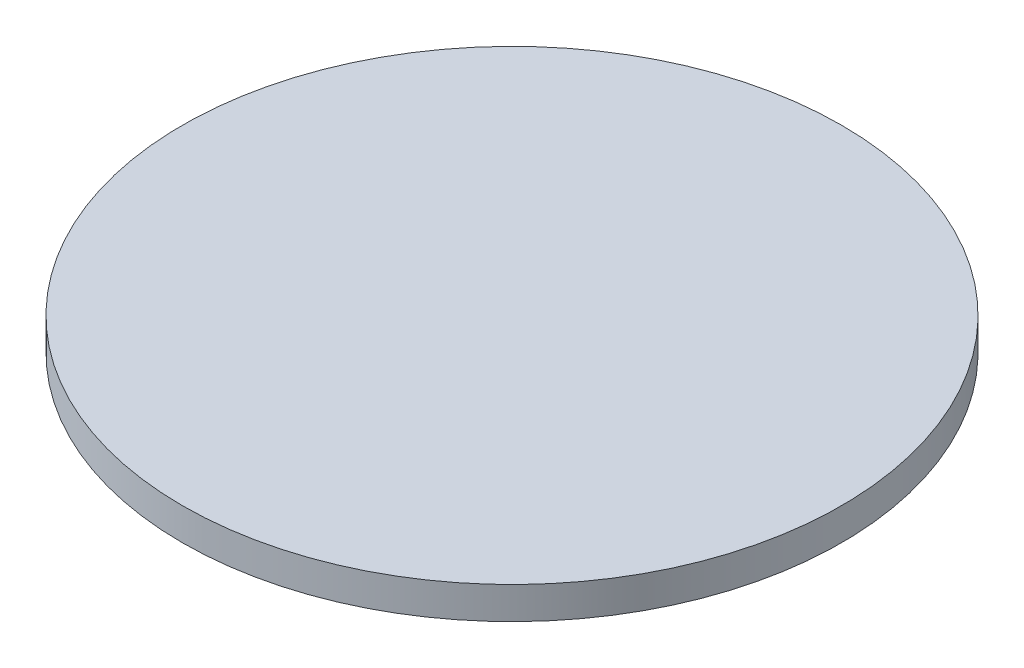
ISO-10303-21;
HEADER;
FILE_DESCRIPTION(('STEP AP214'),'2;1');
FILE_NAME('part.step','',(''),(''),'','','');
FILE_SCHEMA(('AUTOMOTIVE_DESIGN { 1 0 10303 214 1 1 1 1 }'));
ENDSEC;
DATA;
#1=APPLICATION_CONTEXT('core data for automotive mechanical design processes');
#2=APPLICATION_PROTOCOL_DEFINITION('international standard','automotive_design',2000,#1);
#3=PRODUCT_CONTEXT('',#1,'mechanical');
#4=PRODUCT('Part','Part','',(#3));
#5=PRODUCT_RELATED_PRODUCT_CATEGORY('part','',(#4));
#6=PRODUCT_DEFINITION_FORMATION('','',#4);
#7=PRODUCT_DEFINITION_CONTEXT('part definition',#1,'design');
#8=PRODUCT_DEFINITION('design','',#6,#7);
#9=PRODUCT_DEFINITION_SHAPE('','',#8);
#10=(LENGTH_UNIT() NAMED_UNIT(*) SI_UNIT(.MILLI.,.METRE.));
#11=(NAMED_UNIT(*) PLANE_ANGLE_UNIT() SI_UNIT($,.RADIAN.));
#12=(NAMED_UNIT(*) SI_UNIT($,.STERADIAN.) SOLID_ANGLE_UNIT());
#13=UNCERTAINTY_MEASURE_WITH_UNIT(LENGTH_MEASURE(1.E-05),#10,'distance_accuracy_value','');
#14=(GEOMETRIC_REPRESENTATION_CONTEXT(3) GLOBAL_UNCERTAINTY_ASSIGNED_CONTEXT((#13)) GLOBAL_UNIT_ASSIGNED_CONTEXT((#10,
#11,#12)) REPRESENTATION_CONTEXT('',''));
#15=CARTESIAN_POINT('',(0.,0.,0.));
#16=DIRECTION('',(0.,0.,1.));
#17=DIRECTION('',(1.,0.,0.));
#18=AXIS2_PLACEMENT_3D('',#15,#16,#17);
#19=CARTESIAN_POINT('',(0.,3.,0.));
#20=DIRECTION('',(0.,-1.,0.));
#21=DIRECTION('',(0.,0.,-1.));
#22=AXIS2_PLACEMENT_3D('',#19,#20,#21);
#23=CYLINDRICAL_SURFACE('',#22,30.75);
#24=CARTESIAN_POINT('',(0.,3.,0.));
#25=DIRECTION('',(0.,1.,0.));
#26=DIRECTION('',(0.,0.,1.));
#27=AXIS2_PLACEMENT_3D('',#24,#25,#26);
#28=CIRCLE('',#27,30.75);
#29=CARTESIAN_POINT('',(0.,3.,30.75));
#30=VERTEX_POINT('',#29);
#31=EDGE_CURVE('E10',#30,#30,#28,.T.);
#32=ORIENTED_EDGE('',*,*,#31,.F.);
#33=EDGE_LOOP('',(#32));
#34=FACE_BOUND('',#33,.T.);
#35=CARTESIAN_POINT('',(0.,0.,0.));
#36=DIRECTION('',(0.,1.,0.));
#37=DIRECTION('',(0.,0.,1.));
#38=AXIS2_PLACEMENT_3D('',#35,#36,#37);
#39=CIRCLE('',#38,30.75);
#40=CARTESIAN_POINT('',(0.,0.,30.75));
#41=VERTEX_POINT('',#40);
#42=EDGE_CURVE('E40',#41,#41,#39,.T.);
#43=ORIENTED_EDGE('',*,*,#42,.T.);
#44=EDGE_LOOP('',(#43));
#45=FACE_BOUND('',#44,.T.);
#46=ADVANCED_FACE('F37',(#34,#45),#23,.T.);
#47=CARTESIAN_POINT('',(0.,3.,0.));
#48=DIRECTION('',(0.,1.,0.));
#49=DIRECTION('',(0.,0.,1.));
#50=AXIS2_PLACEMENT_3D('',#47,#48,#49);
#51=PLANE('',#50);
#52=ORIENTED_EDGE('',*,*,#31,.T.);
#53=EDGE_LOOP('',(#52));
#54=FACE_BOUND('',#53,.T.);
#55=ADVANCED_FACE('F54',(#54),#51,.T.);
#56=CARTESIAN_POINT('',(0.,0.,0.));
#57=DIRECTION('',(0.,1.,0.));
#58=DIRECTION('',(0.,0.,1.));
#59=AXIS2_PLACEMENT_3D('',#56,#57,#58);
#60=PLANE('',#59);
#61=ORIENTED_EDGE('',*,*,#42,.F.);
#62=EDGE_LOOP('',(#61));
#63=FACE_BOUND('',#62,.T.);
#64=ADVANCED_FACE('F52',(#63),#60,.F.);
#65=CLOSED_SHELL('',(#46,#55,#64));
#66=MANIFOLD_SOLID_BREP('B2',#65);
#67=ADVANCED_BREP_SHAPE_REPRESENTATION('',(#18,#66),#14);
#68=SHAPE_DEFINITION_REPRESENTATION(#9,#67);
ENDSEC;
END-ISO-10303-21;
